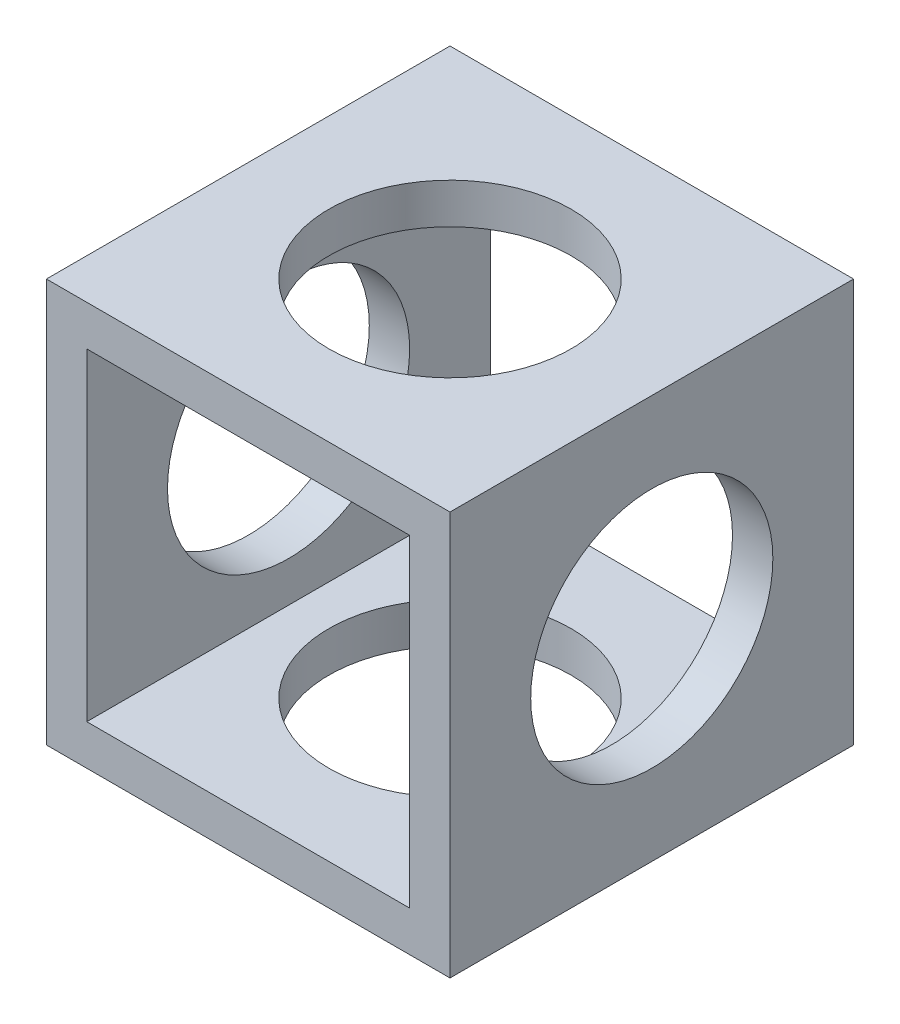
ISO-10303-21;
HEADER;
FILE_DESCRIPTION(('STEP AP214'),'2;1');
FILE_NAME('part.step','',(''),(''),'','','');
FILE_SCHEMA(('AUTOMOTIVE_DESIGN { 1 0 10303 214 1 1 1 1 }'));
ENDSEC;
DATA;
#1=APPLICATION_CONTEXT('core data for automotive mechanical design processes');
#2=APPLICATION_PROTOCOL_DEFINITION('international standard','automotive_design',2000,#1);
#3=PRODUCT_CONTEXT('',#1,'mechanical');
#4=PRODUCT('Part','Part','',(#3));
#5=PRODUCT_RELATED_PRODUCT_CATEGORY('part','',(#4));
#6=PRODUCT_DEFINITION_FORMATION('','',#4);
#7=PRODUCT_DEFINITION_CONTEXT('part definition',#1,'design');
#8=PRODUCT_DEFINITION('design','',#6,#7);
#9=PRODUCT_DEFINITION_SHAPE('','',#8);
#10=(LENGTH_UNIT() NAMED_UNIT(*) SI_UNIT(.MILLI.,.METRE.));
#11=(NAMED_UNIT(*) PLANE_ANGLE_UNIT() SI_UNIT($,.RADIAN.));
#12=(NAMED_UNIT(*) SI_UNIT($,.STERADIAN.) SOLID_ANGLE_UNIT());
#13=UNCERTAINTY_MEASURE_WITH_UNIT(LENGTH_MEASURE(1.E-05),#10,'distance_accuracy_value','');
#14=(GEOMETRIC_REPRESENTATION_CONTEXT(3) GLOBAL_UNCERTAINTY_ASSIGNED_CONTEXT((#13)) GLOBAL_UNIT_ASSIGNED_CONTEXT((#10,
#11,#12)) REPRESENTATION_CONTEXT('',''));
#15=CARTESIAN_POINT('',(0.,0.,0.));
#16=DIRECTION('',(0.,0.,1.));
#17=DIRECTION('',(1.,0.,0.));
#18=AXIS2_PLACEMENT_3D('',#15,#16,#17);
#19=CARTESIAN_POINT('',(25.,-25.,-50.));
#20=DIRECTION('',(1.,0.,0.));
#21=DIRECTION('',(0.,0.,-1.));
#22=AXIS2_PLACEMENT_3D('',#19,#20,#21);
#23=PLANE('',#22);
#24=CARTESIAN_POINT('',(25.,0.,-25.));
#25=DIRECTION('',(1.,0.,0.));
#26=DIRECTION('',(0.,0.,-1.));
#27=AXIS2_PLACEMENT_3D('',#24,#25,#26);
#28=CIRCLE('',#27,15.);
#29=CARTESIAN_POINT('',(25.,0.,-40.));
#30=VERTEX_POINT('',#29);
#31=EDGE_CURVE('E175',#30,#30,#28,.T.);
#32=ORIENTED_EDGE('',*,*,#31,.F.);
#33=EDGE_LOOP('',(#32));
#34=FACE_BOUND('',#33,.T.);
#35=DIRECTION('',(0.,1.,0.));
#36=VECTOR('',#35,1.);
#37=CARTESIAN_POINT('',(25.,-25.,0.));
#38=LINE('',#37,#36);
#39=CARTESIAN_POINT('',(25.,-25.,0.));
#40=VERTEX_POINT('',#39);
#41=CARTESIAN_POINT('',(25.,25.,0.));
#42=VERTEX_POINT('',#41);
#43=EDGE_CURVE('E137',#40,#42,#38,.T.);
#44=ORIENTED_EDGE('',*,*,#43,.F.);
#45=DIRECTION('',(0.,0.,1.));
#46=VECTOR('',#45,1.);
#47=CARTESIAN_POINT('',(25.,-25.,-50.));
#48=LINE('',#47,#46);
#49=CARTESIAN_POINT('',(25.,-25.,-50.));
#50=VERTEX_POINT('',#49);
#51=EDGE_CURVE('E11',#50,#40,#48,.T.);
#52=ORIENTED_EDGE('',*,*,#51,.F.);
#53=DIRECTION('',(0.,1.,0.));
#54=VECTOR('',#53,1.);
#55=CARTESIAN_POINT('',(25.,-25.,-50.));
#56=LINE('',#55,#54);
#57=CARTESIAN_POINT('',(25.,25.,-50.));
#58=VERTEX_POINT('',#57);
#59=EDGE_CURVE('E141',#50,#58,#56,.T.);
#60=ORIENTED_EDGE('',*,*,#59,.T.);
#61=DIRECTION('',(0.,0.,1.));
#62=VECTOR('',#61,1.);
#63=CARTESIAN_POINT('',(25.,25.,-50.));
#64=LINE('',#63,#62);
#65=EDGE_CURVE('E154',#58,#42,#64,.T.);
#66=ORIENTED_EDGE('',*,*,#65,.T.);
#67=EDGE_LOOP('',(#44,#52,#60,#66));
#68=FACE_BOUND('',#67,.T.);
#69=ADVANCED_FACE('F36',(#34,#68),#23,.T.);
#70=CARTESIAN_POINT('',(-25.,-25.,-50.));
#71=DIRECTION('',(0.,-1.,0.));
#72=DIRECTION('',(0.,0.,-1.));
#73=AXIS2_PLACEMENT_3D('',#70,#71,#72);
#74=PLANE('',#73);
#75=CARTESIAN_POINT('',(0.,-25.,-25.));
#76=DIRECTION('',(0.,1.,0.));
#77=DIRECTION('',(0.,0.,1.));
#78=AXIS2_PLACEMENT_3D('',#75,#76,#77);
#79=CIRCLE('',#78,15.);
#80=CARTESIAN_POINT('',(0.,-25.,-10.));
#81=VERTEX_POINT('',#80);
#82=EDGE_CURVE('E187',#81,#81,#79,.T.);
#83=ORIENTED_EDGE('',*,*,#82,.T.);
#84=EDGE_LOOP('',(#83));
#85=FACE_BOUND('',#84,.T.);
#86=DIRECTION('',(1.,0.,0.));
#87=VECTOR('',#86,1.);
#88=CARTESIAN_POINT('',(-25.,-25.,0.));
#89=LINE('',#88,#87);
#90=CARTESIAN_POINT('',(-25.,-25.,0.));
#91=VERTEX_POINT('',#90);
#92=EDGE_CURVE('E145',#91,#40,#89,.T.);
#93=ORIENTED_EDGE('',*,*,#92,.F.);
#94=DIRECTION('',(0.,0.,1.));
#95=VECTOR('',#94,1.);
#96=CARTESIAN_POINT('',(-25.,-25.,-50.));
#97=LINE('',#96,#95);
#98=CARTESIAN_POINT('',(-25.,-25.,-50.));
#99=VERTEX_POINT('',#98);
#100=EDGE_CURVE('E44',#99,#91,#97,.T.);
#101=ORIENTED_EDGE('',*,*,#100,.F.);
#102=DIRECTION('',(1.,0.,0.));
#103=VECTOR('',#102,1.);
#104=CARTESIAN_POINT('',(-25.,-25.,-50.));
#105=LINE('',#104,#103);
#106=EDGE_CURVE('E151',#99,#50,#105,.T.);
#107=ORIENTED_EDGE('',*,*,#106,.T.);
#108=ORIENTED_EDGE('',*,*,#51,.T.);
#109=EDGE_LOOP('',(#93,#101,#107,#108));
#110=FACE_BOUND('',#109,.T.);
#111=ADVANCED_FACE('F210',(#85,#110),#74,.T.);
#112=CARTESIAN_POINT('',(-25.,-25.,-50.));
#113=DIRECTION('',(-1.,0.,0.));
#114=DIRECTION('',(0.,0.,1.));
#115=AXIS2_PLACEMENT_3D('',#112,#113,#114);
#116=PLANE('',#115);
#117=CARTESIAN_POINT('',(-25.,0.,-25.));
#118=DIRECTION('',(1.,0.,0.));
#119=DIRECTION('',(0.,0.,-1.));
#120=AXIS2_PLACEMENT_3D('',#117,#118,#119);
#121=CIRCLE('',#120,15.);
#122=CARTESIAN_POINT('',(-25.,0.,-40.));
#123=VERTEX_POINT('',#122);
#124=EDGE_CURVE('E170',#123,#123,#121,.T.);
#125=ORIENTED_EDGE('',*,*,#124,.T.);
#126=EDGE_LOOP('',(#125));
#127=FACE_BOUND('',#126,.T.);
#128=DIRECTION('',(0.,-1.,0.));
#129=VECTOR('',#128,1.);
#130=CARTESIAN_POINT('',(-25.,-25.,0.));
#131=LINE('',#130,#129);
#132=CARTESIAN_POINT('',(-25.,25.,0.));
#133=VERTEX_POINT('',#132);
#134=EDGE_CURVE('E160',#133,#91,#131,.T.);
#135=ORIENTED_EDGE('',*,*,#134,.F.);
#136=DIRECTION('',(0.,0.,1.));
#137=VECTOR('',#136,1.);
#138=CARTESIAN_POINT('',(-25.,25.,-50.));
#139=LINE('',#138,#137);
#140=CARTESIAN_POINT('',(-25.,25.,-50.));
#141=VERTEX_POINT('',#140);
#142=EDGE_CURVE('E166',#141,#133,#139,.T.);
#143=ORIENTED_EDGE('',*,*,#142,.F.);
#144=DIRECTION('',(0.,-1.,0.));
#145=VECTOR('',#144,1.);
#146=CARTESIAN_POINT('',(-25.,-25.,-50.));
#147=LINE('',#146,#145);
#148=EDGE_CURVE('E148',#141,#99,#147,.T.);
#149=ORIENTED_EDGE('',*,*,#148,.T.);
#150=ORIENTED_EDGE('',*,*,#100,.T.);
#151=EDGE_LOOP('',(#135,#143,#149,#150));
#152=FACE_BOUND('',#151,.T.);
#153=ADVANCED_FACE('F215',(#127,#152),#116,.T.);
#154=CARTESIAN_POINT('',(-25.,25.,-50.));
#155=DIRECTION('',(0.,1.,0.));
#156=DIRECTION('',(0.,0.,1.));
#157=AXIS2_PLACEMENT_3D('',#154,#155,#156);
#158=PLANE('',#157);
#159=CARTESIAN_POINT('',(0.,25.,-25.));
#160=DIRECTION('',(0.,1.,0.));
#161=DIRECTION('',(0.,0.,1.));
#162=AXIS2_PLACEMENT_3D('',#159,#160,#161);
#163=CIRCLE('',#162,15.);
#164=CARTESIAN_POINT('',(0.,25.,-10.));
#165=VERTEX_POINT('',#164);
#166=EDGE_CURVE('E184',#165,#165,#163,.T.);
#167=ORIENTED_EDGE('',*,*,#166,.F.);
#168=EDGE_LOOP('',(#167));
#169=FACE_BOUND('',#168,.T.);
#170=DIRECTION('',(-1.,0.,0.));
#171=VECTOR('',#170,1.);
#172=CARTESIAN_POINT('',(-25.,25.,0.));
#173=LINE('',#172,#171);
#174=EDGE_CURVE('E157',#42,#133,#173,.T.);
#175=ORIENTED_EDGE('',*,*,#174,.F.);
#176=ORIENTED_EDGE('',*,*,#65,.F.);
#177=DIRECTION('',(-1.,0.,0.));
#178=VECTOR('',#177,1.);
#179=CARTESIAN_POINT('',(-25.,25.,-50.));
#180=LINE('',#179,#178);
#181=EDGE_CURVE('E144',#58,#141,#180,.T.);
#182=ORIENTED_EDGE('',*,*,#181,.T.);
#183=ORIENTED_EDGE('',*,*,#142,.T.);
#184=EDGE_LOOP('',(#175,#176,#182,#183));
#185=FACE_BOUND('',#184,.T.);
#186=ADVANCED_FACE('F231',(#169,#185),#158,.T.);
#187=CARTESIAN_POINT('',(0.,0.,-50.));
#188=DIRECTION('',(0.,0.,-1.));
#189=DIRECTION('',(-1.,0.,0.));
#190=AXIS2_PLACEMENT_3D('',#187,#188,#189);
#191=PLANE('',#190);
#192=DIRECTION('',(0.,1.,0.));
#193=VECTOR('',#192,1.);
#194=CARTESIAN_POINT('',(20.,-20.,-50.));
#195=LINE('',#194,#193);
#196=CARTESIAN_POINT('',(20.,-20.,-50.));
#197=VERTEX_POINT('',#196);
#198=CARTESIAN_POINT('',(20.,20.,-50.));
#199=VERTEX_POINT('',#198);
#200=EDGE_CURVE('E103',#197,#199,#195,.T.);
#201=ORIENTED_EDGE('',*,*,#200,.T.);
#202=DIRECTION('',(-1.,0.,0.));
#203=VECTOR('',#202,1.);
#204=CARTESIAN_POINT('',(-20.,20.,-50.));
#205=LINE('',#204,#203);
#206=CARTESIAN_POINT('',(-20.,20.,-50.));
#207=VERTEX_POINT('',#206);
#208=EDGE_CURVE('E112',#199,#207,#205,.T.);
#209=ORIENTED_EDGE('',*,*,#208,.T.);
#210=DIRECTION('',(0.,-1.,0.));
#211=VECTOR('',#210,1.);
#212=CARTESIAN_POINT('',(-20.,-20.,-50.));
#213=LINE('',#212,#211);
#214=CARTESIAN_POINT('',(-20.,-20.,-50.));
#215=VERTEX_POINT('',#214);
#216=EDGE_CURVE('E52',#207,#215,#213,.T.);
#217=ORIENTED_EDGE('',*,*,#216,.T.);
#218=DIRECTION('',(1.,0.,0.));
#219=VECTOR('',#218,1.);
#220=CARTESIAN_POINT('',(-20.,-20.,-50.));
#221=LINE('',#220,#219);
#222=EDGE_CURVE('E109',#215,#197,#221,.T.);
#223=ORIENTED_EDGE('',*,*,#222,.T.);
#224=EDGE_LOOP('',(#201,#209,#217,#223));
#225=FACE_BOUND('',#224,.T.);
#226=ORIENTED_EDGE('',*,*,#59,.F.);
#227=ORIENTED_EDGE('',*,*,#106,.F.);
#228=ORIENTED_EDGE('',*,*,#148,.F.);
#229=ORIENTED_EDGE('',*,*,#181,.F.);
#230=EDGE_LOOP('',(#226,#227,#228,#229));
#231=FACE_BOUND('',#230,.T.);
#232=ADVANCED_FACE('F116',(#225,#231),#191,.T.);
#233=CARTESIAN_POINT('',(0.,0.,0.));
#234=DIRECTION('',(0.,0.,-1.));
#235=DIRECTION('',(-1.,0.,0.));
#236=AXIS2_PLACEMENT_3D('',#233,#234,#235);
#237=PLANE('',#236);
#238=DIRECTION('',(-1.,0.,0.));
#239=VECTOR('',#238,1.);
#240=CARTESIAN_POINT('',(-20.,20.,0.));
#241=LINE('',#240,#239);
#242=CARTESIAN_POINT('',(20.,20.,0.));
#243=VERTEX_POINT('',#242);
#244=CARTESIAN_POINT('',(-20.,20.,0.));
#245=VERTEX_POINT('',#244);
#246=EDGE_CURVE('E131',#243,#245,#241,.T.);
#247=ORIENTED_EDGE('',*,*,#246,.F.);
#248=DIRECTION('',(0.,1.,0.));
#249=VECTOR('',#248,1.);
#250=CARTESIAN_POINT('',(20.,-20.,0.));
#251=LINE('',#250,#249);
#252=CARTESIAN_POINT('',(20.,-20.,0.));
#253=VERTEX_POINT('',#252);
#254=EDGE_CURVE('E60',#253,#243,#251,.T.);
#255=ORIENTED_EDGE('',*,*,#254,.F.);
#256=DIRECTION('',(1.,0.,0.));
#257=VECTOR('',#256,1.);
#258=CARTESIAN_POINT('',(-20.,-20.,0.));
#259=LINE('',#258,#257);
#260=CARTESIAN_POINT('',(-20.,-20.,0.));
#261=VERTEX_POINT('',#260);
#262=EDGE_CURVE('E119',#261,#253,#259,.T.);
#263=ORIENTED_EDGE('',*,*,#262,.F.);
#264=DIRECTION('',(0.,-1.,0.));
#265=VECTOR('',#264,1.);
#266=CARTESIAN_POINT('',(-20.,-20.,0.));
#267=LINE('',#266,#265);
#268=EDGE_CURVE('E122',#245,#261,#267,.T.);
#269=ORIENTED_EDGE('',*,*,#268,.F.);
#270=EDGE_LOOP('',(#247,#255,#263,#269));
#271=FACE_BOUND('',#270,.T.);
#272=ORIENTED_EDGE('',*,*,#43,.T.);
#273=ORIENTED_EDGE('',*,*,#174,.T.);
#274=ORIENTED_EDGE('',*,*,#134,.T.);
#275=ORIENTED_EDGE('',*,*,#92,.T.);
#276=EDGE_LOOP('',(#272,#273,#274,#275));
#277=FACE_BOUND('',#276,.T.);
#278=ADVANCED_FACE('F224',(#271,#277),#237,.F.);
#279=CARTESIAN_POINT('',(20.,-20.,-50.));
#280=DIRECTION('',(1.,0.,0.));
#281=DIRECTION('',(0.,0.,-1.));
#282=AXIS2_PLACEMENT_3D('',#279,#280,#281);
#283=PLANE('',#282);
#284=CARTESIAN_POINT('',(20.,0.,-25.));
#285=DIRECTION('',(1.,0.,0.));
#286=DIRECTION('',(0.,0.,-1.));
#287=AXIS2_PLACEMENT_3D('',#284,#285,#286);
#288=CIRCLE('',#287,15.);
#289=CARTESIAN_POINT('',(20.,0.,-40.));
#290=VERTEX_POINT('',#289);
#291=EDGE_CURVE('E125',#290,#290,#288,.T.);
#292=ORIENTED_EDGE('',*,*,#291,.T.);
#293=EDGE_LOOP('',(#292));
#294=FACE_BOUND('',#293,.T.);
#295=ORIENTED_EDGE('',*,*,#254,.T.);
#296=DIRECTION('',(0.,0.,1.));
#297=VECTOR('',#296,1.);
#298=CARTESIAN_POINT('',(20.,20.,-50.));
#299=LINE('',#298,#297);
#300=EDGE_CURVE('E99',#199,#243,#299,.T.);
#301=ORIENTED_EDGE('',*,*,#300,.F.);
#302=ORIENTED_EDGE('',*,*,#200,.F.);
#303=DIRECTION('',(0.,0.,1.));
#304=VECTOR('',#303,1.);
#305=CARTESIAN_POINT('',(20.,-20.,-50.));
#306=LINE('',#305,#304);
#307=EDGE_CURVE('E135',#197,#253,#306,.T.);
#308=ORIENTED_EDGE('',*,*,#307,.T.);
#309=EDGE_LOOP('',(#295,#301,#302,#308));
#310=FACE_BOUND('',#309,.T.);
#311=ADVANCED_FACE('F101',(#294,#310),#283,.F.);
#312=CARTESIAN_POINT('',(-20.,-20.,-50.));
#313=DIRECTION('',(0.,-1.,0.));
#314=DIRECTION('',(0.,0.,-1.));
#315=AXIS2_PLACEMENT_3D('',#312,#313,#314);
#316=PLANE('',#315);
#317=CARTESIAN_POINT('',(0.,-20.,-25.));
#318=DIRECTION('',(0.,-1.,0.));
#319=DIRECTION('',(0.,0.,-1.));
#320=AXIS2_PLACEMENT_3D('',#317,#318,#319);
#321=CIRCLE('',#320,15.);
#322=CARTESIAN_POINT('',(0.,-20.,-40.));
#323=VERTEX_POINT('',#322);
#324=EDGE_CURVE('E180',#323,#323,#321,.T.);
#325=ORIENTED_EDGE('',*,*,#324,.T.);
#326=EDGE_LOOP('',(#325));
#327=FACE_BOUND('',#326,.T.);
#328=ORIENTED_EDGE('',*,*,#262,.T.);
#329=ORIENTED_EDGE('',*,*,#307,.F.);
#330=ORIENTED_EDGE('',*,*,#222,.F.);
#331=DIRECTION('',(0.,0.,1.));
#332=VECTOR('',#331,1.);
#333=CARTESIAN_POINT('',(-20.,-20.,-50.));
#334=LINE('',#333,#332);
#335=EDGE_CURVE('E138',#215,#261,#334,.T.);
#336=ORIENTED_EDGE('',*,*,#335,.T.);
#337=EDGE_LOOP('',(#328,#329,#330,#336));
#338=FACE_BOUND('',#337,.T.);
#339=ADVANCED_FACE('F247',(#327,#338),#316,.F.);
#340=CARTESIAN_POINT('',(-20.,-20.,-50.));
#341=DIRECTION('',(-1.,0.,0.));
#342=DIRECTION('',(0.,0.,1.));
#343=AXIS2_PLACEMENT_3D('',#340,#341,#342);
#344=PLANE('',#343);
#345=CARTESIAN_POINT('',(-20.,0.,-25.));
#346=DIRECTION('',(-1.,0.,0.));
#347=DIRECTION('',(0.,0.,1.));
#348=AXIS2_PLACEMENT_3D('',#345,#346,#347);
#349=CIRCLE('',#348,15.);
#350=CARTESIAN_POINT('',(-20.,0.,-10.));
#351=VERTEX_POINT('',#350);
#352=EDGE_CURVE('E168',#351,#351,#349,.T.);
#353=ORIENTED_EDGE('',*,*,#352,.T.);
#354=EDGE_LOOP('',(#353));
#355=FACE_BOUND('',#354,.T.);
#356=ORIENTED_EDGE('',*,*,#268,.T.);
#357=ORIENTED_EDGE('',*,*,#335,.F.);
#358=ORIENTED_EDGE('',*,*,#216,.F.);
#359=DIRECTION('',(0.,0.,1.));
#360=VECTOR('',#359,1.);
#361=CARTESIAN_POINT('',(-20.,20.,-50.));
#362=LINE('',#361,#360);
#363=EDGE_CURVE('E108',#207,#245,#362,.T.);
#364=ORIENTED_EDGE('',*,*,#363,.T.);
#365=EDGE_LOOP('',(#356,#357,#358,#364));
#366=FACE_BOUND('',#365,.T.);
#367=ADVANCED_FACE('F251',(#355,#366),#344,.F.);
#368=CARTESIAN_POINT('',(-20.,20.,-50.));
#369=DIRECTION('',(0.,1.,0.));
#370=DIRECTION('',(0.,0.,1.));
#371=AXIS2_PLACEMENT_3D('',#368,#369,#370);
#372=PLANE('',#371);
#373=CARTESIAN_POINT('',(0.,20.,-25.));
#374=DIRECTION('',(0.,1.,0.));
#375=DIRECTION('',(0.,0.,1.));
#376=AXIS2_PLACEMENT_3D('',#373,#374,#375);
#377=CIRCLE('',#376,15.);
#378=CARTESIAN_POINT('',(0.,20.,-10.));
#379=VERTEX_POINT('',#378);
#380=EDGE_CURVE('E39',#379,#379,#377,.T.);
#381=ORIENTED_EDGE('',*,*,#380,.T.);
#382=EDGE_LOOP('',(#381));
#383=FACE_BOUND('',#382,.T.);
#384=ORIENTED_EDGE('',*,*,#246,.T.);
#385=ORIENTED_EDGE('',*,*,#363,.F.);
#386=ORIENTED_EDGE('',*,*,#208,.F.);
#387=ORIENTED_EDGE('',*,*,#300,.T.);
#388=EDGE_LOOP('',(#384,#385,#386,#387));
#389=FACE_BOUND('',#388,.T.);
#390=ADVANCED_FACE('F113',(#383,#389),#372,.F.);
#391=CARTESIAN_POINT('',(-25.,0.,-25.));
#392=DIRECTION('',(1.,0.,0.));
#393=DIRECTION('',(0.,0.,-1.));
#394=AXIS2_PLACEMENT_3D('',#391,#392,#393);
#395=CYLINDRICAL_SURFACE('',#394,15.);
#396=ORIENTED_EDGE('',*,*,#124,.F.);
#397=EDGE_LOOP('',(#396));
#398=FACE_BOUND('',#397,.T.);
#399=ORIENTED_EDGE('',*,*,#352,.F.);
#400=EDGE_LOOP('',(#399));
#401=FACE_BOUND('',#400,.T.);
#402=ADVANCED_FACE('F206',(#398,#401),#395,.F.);
#403=ORIENTED_EDGE('',*,*,#31,.T.);
#404=EDGE_LOOP('',(#403));
#405=FACE_BOUND('',#404,.T.);
#406=ORIENTED_EDGE('',*,*,#291,.F.);
#407=EDGE_LOOP('',(#406));
#408=FACE_BOUND('',#407,.T.);
#409=ADVANCED_FACE('F198',(#405,#408),#395,.F.);
#410=CARTESIAN_POINT('',(0.,-25.,-25.));
#411=DIRECTION('',(0.,1.,0.));
#412=DIRECTION('',(0.,0.,1.));
#413=AXIS2_PLACEMENT_3D('',#410,#411,#412);
#414=CYLINDRICAL_SURFACE('',#413,15.);
#415=ORIENTED_EDGE('',*,*,#166,.T.);
#416=EDGE_LOOP('',(#415));
#417=FACE_BOUND('',#416,.T.);
#418=ORIENTED_EDGE('',*,*,#380,.F.);
#419=EDGE_LOOP('',(#418));
#420=FACE_BOUND('',#419,.T.);
#421=ADVANCED_FACE('F195',(#417,#420),#414,.F.);
#422=ORIENTED_EDGE('',*,*,#82,.F.);
#423=EDGE_LOOP('',(#422));
#424=FACE_BOUND('',#423,.T.);
#425=ORIENTED_EDGE('',*,*,#324,.F.);
#426=EDGE_LOOP('',(#425));
#427=FACE_BOUND('',#426,.T.);
#428=ADVANCED_FACE('F197',(#424,#427),#414,.F.);
#429=CLOSED_SHELL('',(#69,#111,#153,#186,#232,#278,#311,#339,#367,#390,#402,#409,#421,#428));
#430=MANIFOLD_SOLID_BREP('B2',#429);
#431=ADVANCED_BREP_SHAPE_REPRESENTATION('',(#18,#430),#14);
#432=SHAPE_DEFINITION_REPRESENTATION(#9,#431);
ENDSEC;
END-ISO-10303-21;
